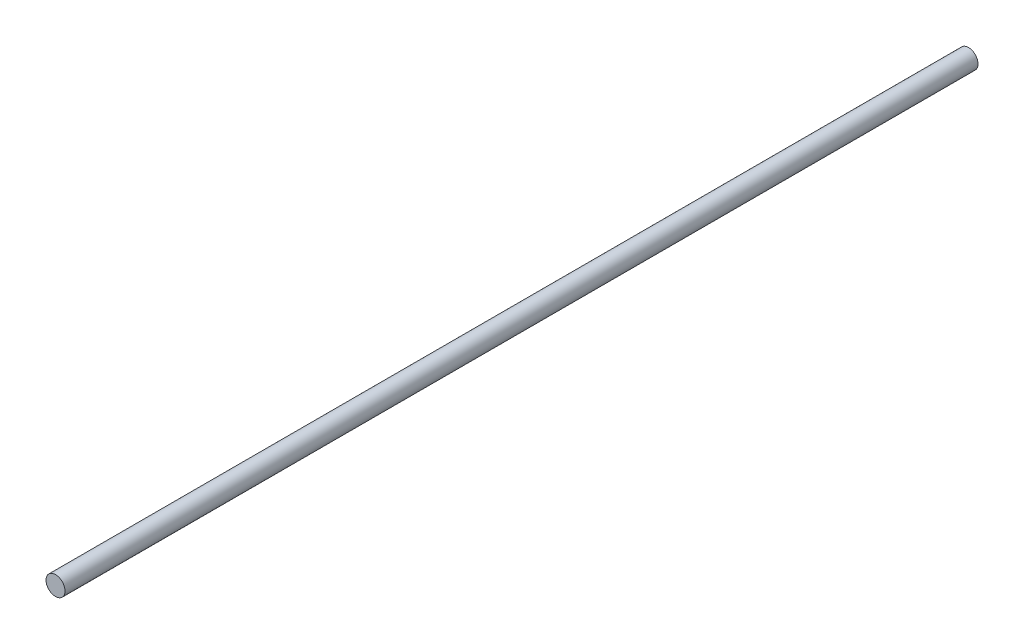
ISO-10303-21;
HEADER;
FILE_DESCRIPTION(('STEP AP214'),'2;1');
FILE_NAME('part.step','',(''),(''),'','','');
FILE_SCHEMA(('AUTOMOTIVE_DESIGN { 1 0 10303 214 1 1 1 1 }'));
ENDSEC;
DATA;
#1=APPLICATION_CONTEXT('core data for automotive mechanical design processes');
#2=APPLICATION_PROTOCOL_DEFINITION('international standard','automotive_design',2000,#1);
#3=PRODUCT_CONTEXT('',#1,'mechanical');
#4=PRODUCT('Part','Part','',(#3));
#5=PRODUCT_RELATED_PRODUCT_CATEGORY('part','',(#4));
#6=PRODUCT_DEFINITION_FORMATION('','',#4);
#7=PRODUCT_DEFINITION_CONTEXT('part definition',#1,'design');
#8=PRODUCT_DEFINITION('design','',#6,#7);
#9=PRODUCT_DEFINITION_SHAPE('','',#8);
#10=(LENGTH_UNIT() NAMED_UNIT(*) SI_UNIT(.MILLI.,.METRE.));
#11=(NAMED_UNIT(*) PLANE_ANGLE_UNIT() SI_UNIT($,.RADIAN.));
#12=(NAMED_UNIT(*) SI_UNIT($,.STERADIAN.) SOLID_ANGLE_UNIT());
#13=UNCERTAINTY_MEASURE_WITH_UNIT(LENGTH_MEASURE(1.E-05),#10,'distance_accuracy_value','');
#14=(GEOMETRIC_REPRESENTATION_CONTEXT(3) GLOBAL_UNCERTAINTY_ASSIGNED_CONTEXT((#13)) GLOBAL_UNIT_ASSIGNED_CONTEXT((#10,
#11,#12)) REPRESENTATION_CONTEXT('',''));
#15=CARTESIAN_POINT('',(0.,0.,0.));
#16=DIRECTION('',(0.,0.,1.));
#17=DIRECTION('',(1.,0.,0.));
#18=AXIS2_PLACEMENT_3D('',#15,#16,#17);
#19=CARTESIAN_POINT('',(0.,0.,76.2));
#20=DIRECTION('',(0.,0.,-1.));
#21=DIRECTION('',(-1.,0.,0.));
#22=AXIS2_PLACEMENT_3D('',#19,#20,#21);
#23=CYLINDRICAL_SURFACE('',#22,0.79375);
#24=CARTESIAN_POINT('',(0.,0.,76.2));
#25=DIRECTION('',(0.,0.,1.));
#26=DIRECTION('',(1.,0.,0.));
#27=AXIS2_PLACEMENT_3D('',#24,#25,#26);
#28=CIRCLE('',#27,0.79375);
#29=CARTESIAN_POINT('',(-0.79375,0.,76.2));
#30=VERTEX_POINT('',#29);
#31=EDGE_CURVE('E10',#30,#30,#28,.T.);
#32=CARTESIAN_POINT('',(0.,0.,0.));
#33=DIRECTION('',(0.,0.,1.));
#34=DIRECTION('',(1.,0.,0.));
#35=AXIS2_PLACEMENT_3D('',#32,#33,#34);
#36=CIRCLE('',#35,0.79375);
#37=CARTESIAN_POINT('',(-0.79375,0.,0.));
#38=VERTEX_POINT('',#37);
#39=EDGE_CURVE('E37',#38,#38,#36,.T.);
#40=CARTESIAN_POINT('',(-0.79375,0.,76.2));
#41=CARTESIAN_POINT('',(-0.79375,0.,75.40625));
#42=CARTESIAN_POINT('',(-0.79375,0.,74.6125));
#43=CARTESIAN_POINT('',(-0.79375,0.,73.025));
#44=CARTESIAN_POINT('',(-0.79375,0.,72.23125));
#45=CARTESIAN_POINT('',(-0.79375,0.,70.64375));
#46=CARTESIAN_POINT('',(-0.79375,0.,69.85));
#47=CARTESIAN_POINT('',(-0.79375,0.,68.2625));
#48=CARTESIAN_POINT('',(-0.79375,0.,67.46875));
#49=CARTESIAN_POINT('',(-0.79375,0.,65.88125));
#50=CARTESIAN_POINT('',(-0.79375,0.,65.0875));
#51=CARTESIAN_POINT('',(-0.79375,0.,63.5));
#52=CARTESIAN_POINT('',(-0.79375,0.,62.70625));
#53=CARTESIAN_POINT('',(-0.79375,0.,61.11875));
#54=CARTESIAN_POINT('',(-0.79375,0.,60.325));
#55=CARTESIAN_POINT('',(-0.79375,0.,58.7375));
#56=CARTESIAN_POINT('',(-0.79375,0.,57.94375));
#57=CARTESIAN_POINT('',(-0.79375,0.,56.35625));
#58=CARTESIAN_POINT('',(-0.79375,0.,55.5625));
#59=CARTESIAN_POINT('',(-0.79375,0.,53.975));
#60=CARTESIAN_POINT('',(-0.79375,0.,53.18125));
#61=CARTESIAN_POINT('',(-0.79375,0.,51.59375));
#62=CARTESIAN_POINT('',(-0.79375,0.,50.8));
#63=CARTESIAN_POINT('',(-0.79375,0.,49.2125));
#64=CARTESIAN_POINT('',(-0.79375,0.,48.41875));
#65=CARTESIAN_POINT('',(-0.79375,0.,46.83125));
#66=CARTESIAN_POINT('',(-0.79375,0.,46.0375));
#67=CARTESIAN_POINT('',(-0.79375,0.,44.45));
#68=CARTESIAN_POINT('',(-0.79375,0.,43.65625));
#69=CARTESIAN_POINT('',(-0.79375,0.,42.06875));
#70=CARTESIAN_POINT('',(-0.79375,0.,41.275));
#71=CARTESIAN_POINT('',(-0.79375,0.,39.6875));
#72=CARTESIAN_POINT('',(-0.79375,0.,38.89375));
#73=CARTESIAN_POINT('',(-0.79375,0.,37.30625));
#74=CARTESIAN_POINT('',(-0.79375,0.,36.5125));
#75=CARTESIAN_POINT('',(-0.79375,0.,34.925));
#76=CARTESIAN_POINT('',(-0.79375,0.,34.13125));
#77=CARTESIAN_POINT('',(-0.79375,0.,32.54375));
#78=CARTESIAN_POINT('',(-0.79375,0.,31.75));
#79=CARTESIAN_POINT('',(-0.79375,0.,30.1625));
#80=CARTESIAN_POINT('',(-0.79375,0.,29.36875));
#81=CARTESIAN_POINT('',(-0.79375,0.,27.78125));
#82=CARTESIAN_POINT('',(-0.79375,0.,26.9875));
#83=CARTESIAN_POINT('',(-0.79375,0.,25.4));
#84=CARTESIAN_POINT('',(-0.79375,0.,24.60625));
#85=CARTESIAN_POINT('',(-0.79375,0.,23.01875));
#86=CARTESIAN_POINT('',(-0.79375,0.,22.225));
#87=CARTESIAN_POINT('',(-0.79375,0.,20.6375));
#88=CARTESIAN_POINT('',(-0.79375,0.,19.84375));
#89=CARTESIAN_POINT('',(-0.79375,0.,18.25625));
#90=CARTESIAN_POINT('',(-0.79375,0.,17.4625));
#91=CARTESIAN_POINT('',(-0.79375,0.,15.875));
#92=CARTESIAN_POINT('',(-0.79375,0.,15.08125));
#93=CARTESIAN_POINT('',(-0.79375,0.,13.49375));
#94=CARTESIAN_POINT('',(-0.79375,0.,12.7));
#95=CARTESIAN_POINT('',(-0.79375,0.,11.1125));
#96=CARTESIAN_POINT('',(-0.79375,0.,10.31875));
#97=CARTESIAN_POINT('',(-0.79375,0.,8.73125));
#98=CARTESIAN_POINT('',(-0.79375,0.,7.93750000000001));
#99=CARTESIAN_POINT('',(-0.79375,0.,6.35));
#100=CARTESIAN_POINT('',(-0.79375,0.,5.55625));
#101=CARTESIAN_POINT('',(-0.79375,0.,3.96875));
#102=CARTESIAN_POINT('',(-0.79375,0.,3.175));
#103=CARTESIAN_POINT('',(-0.79375,0.,1.5875));
#104=CARTESIAN_POINT('',(-0.79375,0.,0.793750000000001));
#105=CARTESIAN_POINT('',(-0.79375,0.,0.));
#106=B_SPLINE_CURVE_WITH_KNOTS('',3,(#40,#41,#42,#43,#44,#45,#46,#47,#48,#49,#50,#51,#52,#53,
#54,#55,#56,#57,#58,#59,#60,#61,#62,#63,#64,#65,#66,#67,#68,#69,#70,#71,#72,#73,#74,#75,#76,#77,
#78,#79,#80,#81,#82,#83,#84,#85,#86,#87,#88,#89,#90,#91,#92,#93,#94,#95,#96,#97,#98,#99,#100,
#101,#102,#103,#104,#105),.UNSPECIFIED.,.F.,.F.,(4,2,2,2,2,2,2,2,2,2,2,2,2,2,2,2,2,2,2,2,2,2,2,
2,2,2,2,2,2,2,2,2,4),(0.,2.38124999999999,4.76249999999999,7.14374999999999,9.52499999999999,
11.90625,14.2875,16.66875,19.05,21.43125,23.8125,26.19375,28.575,30.95625,33.3375,35.71875,38.1,
40.48125,42.8625,45.24375,47.625,50.00625,52.3875,54.76875,57.15,59.53125,61.9125,64.29375,
66.675,69.05625,71.4375,73.81875,76.2),.UNSPECIFIED.);
#107=EDGE_CURVE('BSEAM40',#30,#38,#106,.T.);
#108=ORIENTED_EDGE('',*,*,#31,.F.);
#109=ORIENTED_EDGE('',*,*,#39,.T.);
#110=ORIENTED_EDGE('',*,*,#107,.T.);
#111=ORIENTED_EDGE('',*,*,#107,.F.);
#112=EDGE_LOOP('',(#108,#110,#109,#111));
#113=FACE_BOUND('',#112,.T.);
#114=ADVANCED_FACE('F40',(#113),#23,.T.);
#115=CARTESIAN_POINT('',(0.,0.,76.2));
#116=DIRECTION('',(0.,0.,1.));
#117=DIRECTION('',(1.,0.,0.));
#118=AXIS2_PLACEMENT_3D('',#115,#116,#117);
#119=PLANE('',#118);
#120=ORIENTED_EDGE('',*,*,#31,.T.);
#121=EDGE_LOOP('',(#120));
#122=FACE_BOUND('',#121,.T.);
#123=ADVANCED_FACE('F55',(#122),#119,.T.);
#124=CARTESIAN_POINT('',(0.,0.,0.));
#125=DIRECTION('',(0.,0.,1.));
#126=DIRECTION('',(1.,0.,0.));
#127=AXIS2_PLACEMENT_3D('',#124,#125,#126);
#128=PLANE('',#127);
#129=ORIENTED_EDGE('',*,*,#39,.F.);
#130=EDGE_LOOP('',(#129));
#131=FACE_BOUND('',#130,.T.);
#132=ADVANCED_FACE('F49',(#131),#128,.F.);
#133=CLOSED_SHELL('',(#114,#123,#132));
#134=MANIFOLD_SOLID_BREP('B2',#133);
#135=ADVANCED_BREP_SHAPE_REPRESENTATION('',(#18,#134),#14);
#136=SHAPE_DEFINITION_REPRESENTATION(#9,#135);
ENDSEC;
END-ISO-10303-21;
